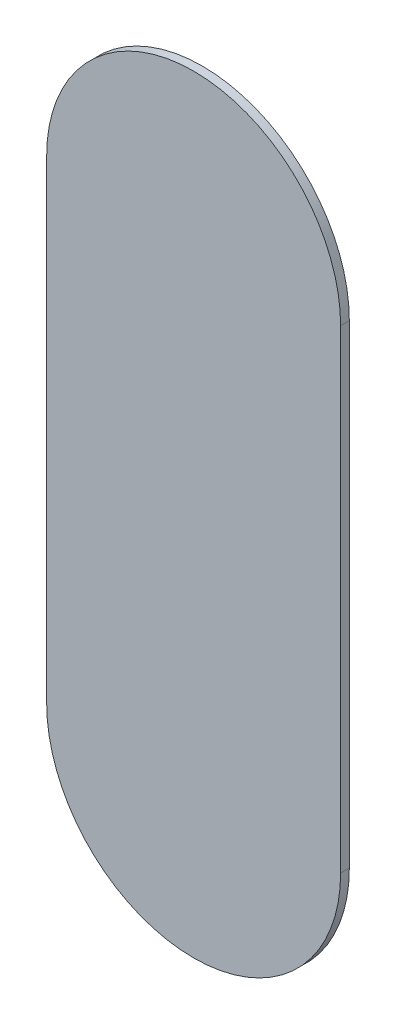
ISO-10303-21;
HEADER;
FILE_DESCRIPTION(('STEP AP214'),'2;1');
FILE_NAME('part.step','',(''),(''),'','','');
FILE_SCHEMA(('AUTOMOTIVE_DESIGN { 1 0 10303 214 1 1 1 1 }'));
ENDSEC;
DATA;
#1=APPLICATION_CONTEXT('core data for automotive mechanical design processes');
#2=APPLICATION_PROTOCOL_DEFINITION('international standard','automotive_design',2000,#1);
#3=PRODUCT_CONTEXT('',#1,'mechanical');
#4=PRODUCT('Part','Part','',(#3));
#5=PRODUCT_RELATED_PRODUCT_CATEGORY('part','',(#4));
#6=PRODUCT_DEFINITION_FORMATION('','',#4);
#7=PRODUCT_DEFINITION_CONTEXT('part definition',#1,'design');
#8=PRODUCT_DEFINITION('design','',#6,#7);
#9=PRODUCT_DEFINITION_SHAPE('','',#8);
#10=(LENGTH_UNIT() NAMED_UNIT(*) SI_UNIT(.MILLI.,.METRE.));
#11=(NAMED_UNIT(*) PLANE_ANGLE_UNIT() SI_UNIT($,.RADIAN.));
#12=(NAMED_UNIT(*) SI_UNIT($,.STERADIAN.) SOLID_ANGLE_UNIT());
#13=UNCERTAINTY_MEASURE_WITH_UNIT(LENGTH_MEASURE(1.E-05),#10,'distance_accuracy_value','');
#14=(GEOMETRIC_REPRESENTATION_CONTEXT(3) GLOBAL_UNCERTAINTY_ASSIGNED_CONTEXT((#13)) GLOBAL_UNIT_ASSIGNED_CONTEXT((#10,
#11,#12)) REPRESENTATION_CONTEXT('',''));
#15=CARTESIAN_POINT('',(0.,0.,0.));
#16=DIRECTION('',(0.,0.,1.));
#17=DIRECTION('',(1.,0.,0.));
#18=AXIS2_PLACEMENT_3D('',#15,#16,#17);
#19=CARTESIAN_POINT('',(52.8731988,116.1913856,0.));
#20=DIRECTION('',(-1.,0.,0.));
#21=DIRECTION('',(0.,1.,0.));
#22=AXIS2_PLACEMENT_3D('',#19,#20,#21);
#23=PLANE('',#22);
#24=DIRECTION('',(0.,1.,0.));
#25=VECTOR('',#24,1.);
#26=CARTESIAN_POINT('',(52.8731988,116.1913856,0.03556));
#27=LINE('',#26,#25);
#28=CARTESIAN_POINT('',(52.8731988,116.1913856,0.03556));
#29=VERTEX_POINT('',#28);
#30=CARTESIAN_POINT('',(52.8731988,118.1268148,0.03556));
#31=VERTEX_POINT('',#30);
#32=EDGE_CURVE('E11',#29,#31,#27,.T.);
#33=ORIENTED_EDGE('',*,*,#32,.F.);
#34=DIRECTION('',(0.,0.,1.));
#35=VECTOR('',#34,1.);
#36=CARTESIAN_POINT('',(52.8731988,116.1913856,0.));
#37=LINE('',#36,#35);
#38=CARTESIAN_POINT('',(52.8731988,116.1913856,0.));
#39=VERTEX_POINT('',#38);
#40=EDGE_CURVE('E24',#39,#29,#37,.T.);
#41=ORIENTED_EDGE('',*,*,#40,.F.);
#42=DIRECTION('',(0.,1.,0.));
#43=VECTOR('',#42,1.);
#44=CARTESIAN_POINT('',(52.8731988,116.1913856,0.));
#45=LINE('',#44,#43);
#46=CARTESIAN_POINT('',(52.8731988,118.1268148,0.));
#47=VERTEX_POINT('',#46);
#48=EDGE_CURVE('E75',#39,#47,#45,.T.);
#49=ORIENTED_EDGE('',*,*,#48,.T.);
#50=DIRECTION('',(0.,0.,1.));
#51=VECTOR('',#50,1.);
#52=CARTESIAN_POINT('',(52.8731988,118.1268148,0.));
#53=LINE('',#52,#51);
#54=EDGE_CURVE('E37',#47,#31,#53,.T.);
#55=ORIENTED_EDGE('',*,*,#54,.T.);
#56=EDGE_LOOP('',(#33,#41,#49,#55));
#57=FACE_BOUND('',#56,.T.);
#58=ADVANCED_FACE('F17',(#57),#23,.F.);
#59=CARTESIAN_POINT('',(52.2732,118.1268148,0.));
#60=DIRECTION('',(0.,0.,-1.));
#61=DIRECTION('',(1.,0.,0.));
#62=AXIS2_PLACEMENT_3D('',#59,#60,#61);
#63=CYLINDRICAL_SURFACE('',#62,0.599998800000004);
#64=CARTESIAN_POINT('',(52.2732,118.1268148,0.03556));
#65=DIRECTION('',(0.,0.,1.));
#66=DIRECTION('',(1.,0.,0.));
#67=AXIS2_PLACEMENT_3D('',#64,#65,#66);
#68=CIRCLE('',#67,0.599998800000004);
#69=CARTESIAN_POINT('',(51.6732012,118.1268148,0.03556));
#70=VERTEX_POINT('',#69);
#71=EDGE_CURVE('E83',#31,#70,#68,.T.);
#72=ORIENTED_EDGE('',*,*,#71,.F.);
#73=ORIENTED_EDGE('',*,*,#54,.F.);
#74=CARTESIAN_POINT('',(52.2732,118.1268148,0.));
#75=DIRECTION('',(0.,0.,1.));
#76=DIRECTION('',(1.,0.,0.));
#77=AXIS2_PLACEMENT_3D('',#74,#75,#76);
#78=CIRCLE('',#77,0.599998800000004);
#79=CARTESIAN_POINT('',(51.6732012,118.1268148,0.));
#80=VERTEX_POINT('',#79);
#81=EDGE_CURVE('E81',#47,#80,#78,.T.);
#82=ORIENTED_EDGE('',*,*,#81,.T.);
#83=DIRECTION('',(0.,0.,1.));
#84=VECTOR('',#83,1.);
#85=CARTESIAN_POINT('',(51.6732012,118.1268148,0.));
#86=LINE('',#85,#84);
#87=EDGE_CURVE('E67',#80,#70,#86,.T.);
#88=ORIENTED_EDGE('',*,*,#87,.T.);
#89=EDGE_LOOP('',(#72,#73,#82,#88));
#90=FACE_BOUND('',#89,.T.);
#91=ADVANCED_FACE('F89',(#90),#63,.T.);
#92=CARTESIAN_POINT('',(51.6732012,118.1268148,0.));
#93=DIRECTION('',(1.,0.,0.));
#94=DIRECTION('',(0.,-1.,0.));
#95=AXIS2_PLACEMENT_3D('',#92,#93,#94);
#96=PLANE('',#95);
#97=DIRECTION('',(0.,-1.,0.));
#98=VECTOR('',#97,1.);
#99=CARTESIAN_POINT('',(51.6732012,118.1268148,0.03556));
#100=LINE('',#99,#98);
#101=CARTESIAN_POINT('',(51.6732012,116.1913856,0.03556));
#102=VERTEX_POINT('',#101);
#103=EDGE_CURVE('E71',#70,#102,#100,.T.);
#104=ORIENTED_EDGE('',*,*,#103,.F.);
#105=ORIENTED_EDGE('',*,*,#87,.F.);
#106=DIRECTION('',(0.,-1.,0.));
#107=VECTOR('',#106,1.);
#108=CARTESIAN_POINT('',(51.6732012,118.1268148,0.));
#109=LINE('',#108,#107);
#110=CARTESIAN_POINT('',(51.6732012,116.1913856,0.));
#111=VERTEX_POINT('',#110);
#112=EDGE_CURVE('E63',#80,#111,#109,.T.);
#113=ORIENTED_EDGE('',*,*,#112,.T.);
#114=DIRECTION('',(0.,0.,1.));
#115=VECTOR('',#114,1.);
#116=CARTESIAN_POINT('',(51.6732012,116.1913856,0.));
#117=LINE('',#116,#115);
#118=EDGE_CURVE('E53',#111,#102,#117,.T.);
#119=ORIENTED_EDGE('',*,*,#118,.T.);
#120=EDGE_LOOP('',(#104,#105,#113,#119));
#121=FACE_BOUND('',#120,.T.);
#122=ADVANCED_FACE('F66',(#121),#96,.F.);
#123=CARTESIAN_POINT('',(52.2732,116.1913856,0.));
#124=DIRECTION('',(0.,0.,-1.));
#125=DIRECTION('',(-1.,0.,0.));
#126=AXIS2_PLACEMENT_3D('',#123,#124,#125);
#127=CYLINDRICAL_SURFACE('',#126,0.599998800000004);
#128=CARTESIAN_POINT('',(52.2732,116.1913856,0.03556));
#129=DIRECTION('',(0.,0.,1.));
#130=DIRECTION('',(-1.,0.,0.));
#131=AXIS2_PLACEMENT_3D('',#128,#129,#130);
#132=CIRCLE('',#131,0.599998800000004);
#133=EDGE_CURVE('E59',#102,#29,#132,.T.);
#134=ORIENTED_EDGE('',*,*,#133,.F.);
#135=ORIENTED_EDGE('',*,*,#118,.F.);
#136=CARTESIAN_POINT('',(52.2732,116.1913856,0.));
#137=DIRECTION('',(0.,0.,1.));
#138=DIRECTION('',(-1.,0.,0.));
#139=AXIS2_PLACEMENT_3D('',#136,#137,#138);
#140=CIRCLE('',#139,0.599998800000004);
#141=EDGE_CURVE('E57',#111,#39,#140,.T.);
#142=ORIENTED_EDGE('',*,*,#141,.T.);
#143=ORIENTED_EDGE('',*,*,#40,.T.);
#144=EDGE_LOOP('',(#134,#135,#142,#143));
#145=FACE_BOUND('',#144,.T.);
#146=ADVANCED_FACE('F55',(#145),#127,.T.);
#147=CARTESIAN_POINT('',(52.8731988,116.1913856,0.));
#148=DIRECTION('',(0.,0.,-1.));
#149=DIRECTION('',(-1.,0.,0.));
#150=AXIS2_PLACEMENT_3D('',#147,#148,#149);
#151=PLANE('',#150);
#152=ORIENTED_EDGE('',*,*,#141,.F.);
#153=ORIENTED_EDGE('',*,*,#112,.F.);
#154=ORIENTED_EDGE('',*,*,#81,.F.);
#155=ORIENTED_EDGE('',*,*,#48,.F.);
#156=EDGE_LOOP('',(#152,#153,#154,#155));
#157=FACE_BOUND('',#156,.T.);
#158=ADVANCED_FACE('F74',(#157),#151,.T.);
#159=CARTESIAN_POINT('',(52.8731988,116.1913856,0.03556));
#160=DIRECTION('',(0.,0.,-1.));
#161=DIRECTION('',(-1.,0.,0.));
#162=AXIS2_PLACEMENT_3D('',#159,#160,#161);
#163=PLANE('',#162);
#164=ORIENTED_EDGE('',*,*,#32,.T.);
#165=ORIENTED_EDGE('',*,*,#71,.T.);
#166=ORIENTED_EDGE('',*,*,#103,.T.);
#167=ORIENTED_EDGE('',*,*,#133,.T.);
#168=EDGE_LOOP('',(#164,#165,#166,#167));
#169=FACE_BOUND('',#168,.T.);
#170=ADVANCED_FACE('F91',(#169),#163,.F.);
#171=CLOSED_SHELL('',(#58,#91,#122,#146,#158,#170));
#172=MANIFOLD_SOLID_BREP('B1',#171);
#173=ADVANCED_BREP_SHAPE_REPRESENTATION('',(#18,#172),#14);
#174=SHAPE_DEFINITION_REPRESENTATION(#9,#173);
ENDSEC;
END-ISO-10303-21;
